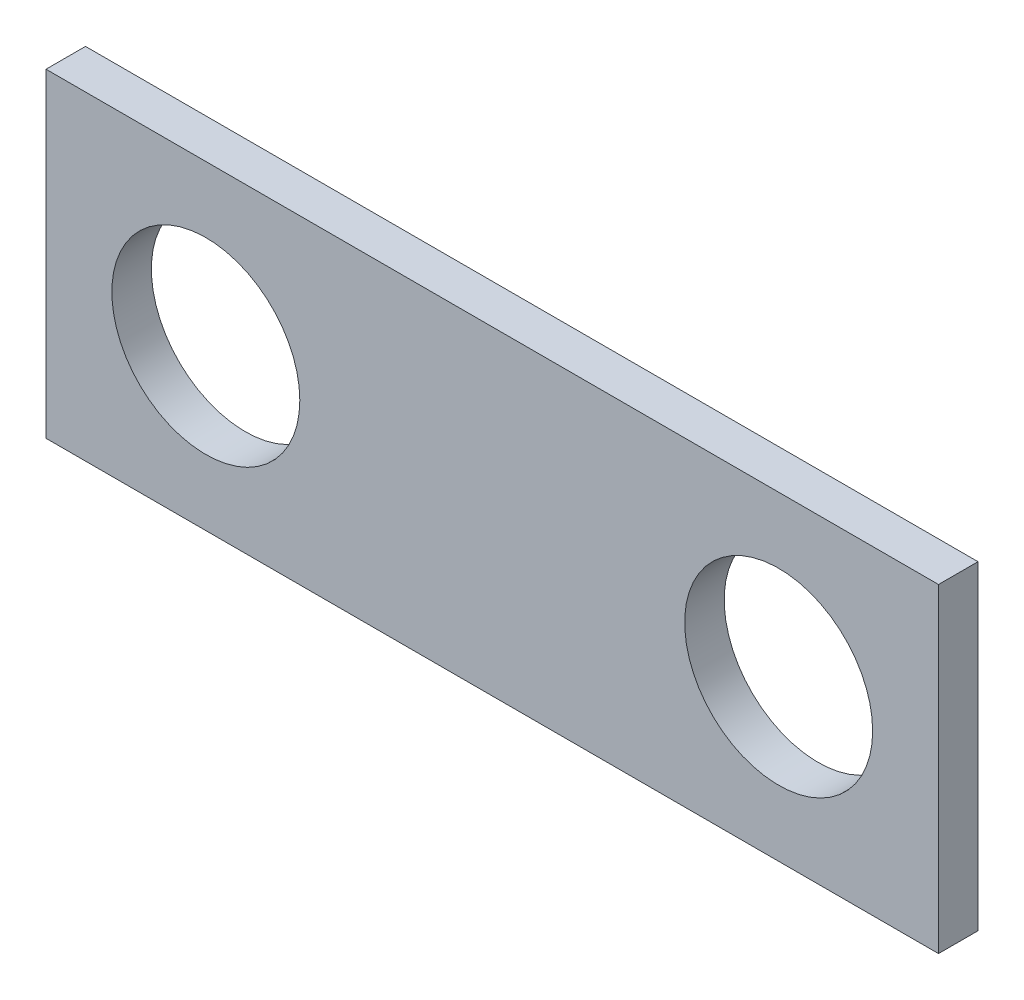
ISO-10303-21;
HEADER;
FILE_DESCRIPTION(('STEP AP214'),'2;1');
FILE_NAME('part.step','',(''),(''),'','','');
FILE_SCHEMA(('AUTOMOTIVE_DESIGN { 1 0 10303 214 1 1 1 1 }'));
ENDSEC;
DATA;
#1=APPLICATION_CONTEXT('core data for automotive mechanical design processes');
#2=APPLICATION_PROTOCOL_DEFINITION('international standard','automotive_design',2000,#1);
#3=PRODUCT_CONTEXT('',#1,'mechanical');
#4=PRODUCT('Part','Part','',(#3));
#5=PRODUCT_RELATED_PRODUCT_CATEGORY('part','',(#4));
#6=PRODUCT_DEFINITION_FORMATION('','',#4);
#7=PRODUCT_DEFINITION_CONTEXT('part definition',#1,'design');
#8=PRODUCT_DEFINITION('design','',#6,#7);
#9=PRODUCT_DEFINITION_SHAPE('','',#8);
#10=(LENGTH_UNIT() NAMED_UNIT(*) SI_UNIT(.MILLI.,.METRE.));
#11=(NAMED_UNIT(*) PLANE_ANGLE_UNIT() SI_UNIT($,.RADIAN.));
#12=(NAMED_UNIT(*) SI_UNIT($,.STERADIAN.) SOLID_ANGLE_UNIT());
#13=UNCERTAINTY_MEASURE_WITH_UNIT(LENGTH_MEASURE(1.E-05),#10,'distance_accuracy_value','');
#14=(GEOMETRIC_REPRESENTATION_CONTEXT(3) GLOBAL_UNCERTAINTY_ASSIGNED_CONTEXT((#13)) GLOBAL_UNIT_ASSIGNED_CONTEXT((#10,
#11,#12)) REPRESENTATION_CONTEXT('',''));
#15=CARTESIAN_POINT('',(0.,0.,0.));
#16=DIRECTION('',(0.,0.,1.));
#17=DIRECTION('',(1.,0.,0.));
#18=AXIS2_PLACEMENT_3D('',#15,#16,#17);
#19=CARTESIAN_POINT('',(0.,0.,6.));
#20=DIRECTION('',(0.,0.,-1.));
#21=DIRECTION('',(-1.,0.,0.));
#22=AXIS2_PLACEMENT_3D('',#19,#20,#21);
#23=PLANE('',#22);
#24=DIRECTION('',(0.,-1.,0.));
#25=VECTOR('',#24,1.);
#26=CARTESIAN_POINT('',(0.,0.,6.));
#27=LINE('',#26,#25);
#28=CARTESIAN_POINT('',(0.,48.5496,6.));
#29=VERTEX_POINT('',#28);
#30=CARTESIAN_POINT('',(0.,0.,6.));
#31=VERTEX_POINT('',#30);
#32=EDGE_CURVE('E91',#29,#31,#27,.T.);
#33=ORIENTED_EDGE('',*,*,#32,.T.);
#34=DIRECTION('',(1.,0.,0.));
#35=VECTOR('',#34,1.);
#36=CARTESIAN_POINT('',(0.,0.,6.));
#37=LINE('',#36,#35);
#38=CARTESIAN_POINT('',(135.5496,0.,6.));
#39=VERTEX_POINT('',#38);
#40=EDGE_CURVE('E86',#31,#39,#37,.T.);
#41=ORIENTED_EDGE('',*,*,#40,.T.);
#42=DIRECTION('',(0.,1.,0.));
#43=VECTOR('',#42,1.);
#44=CARTESIAN_POINT('',(135.5496,0.,6.));
#45=LINE('',#44,#43);
#46=CARTESIAN_POINT('',(135.5496,48.5496,6.));
#47=VERTEX_POINT('',#46);
#48=EDGE_CURVE('E89',#39,#47,#45,.T.);
#49=ORIENTED_EDGE('',*,*,#48,.T.);
#50=DIRECTION('',(-1.,0.,0.));
#51=VECTOR('',#50,1.);
#52=CARTESIAN_POINT('',(0.,48.5496,6.));
#53=LINE('',#52,#51);
#54=EDGE_CURVE('E56',#47,#29,#53,.T.);
#55=ORIENTED_EDGE('',*,*,#54,.T.);
#56=EDGE_LOOP('',(#33,#41,#49,#55));
#57=FACE_BOUND('',#56,.T.);
#58=CARTESIAN_POINT('',(24.2748,24.2748,6.));
#59=DIRECTION('',(0.,0.,1.));
#60=DIRECTION('',(1.,0.,0.));
#61=AXIS2_PLACEMENT_3D('',#58,#59,#60);
#62=CIRCLE('',#61,14.2748);
#63=CARTESIAN_POINT('',(38.5496,24.2748,6.));
#64=VERTEX_POINT('',#63);
#65=EDGE_CURVE('E106',#64,#64,#62,.T.);
#66=ORIENTED_EDGE('',*,*,#65,.F.);
#67=EDGE_LOOP('',(#66));
#68=FACE_BOUND('',#67,.T.);
#69=CARTESIAN_POINT('',(111.2748,24.2748,6.));
#70=DIRECTION('',(0.,0.,1.));
#71=DIRECTION('',(1.,0.,0.));
#72=AXIS2_PLACEMENT_3D('',#69,#70,#71);
#73=CIRCLE('',#72,14.2748);
#74=CARTESIAN_POINT('',(125.5496,24.2748,6.));
#75=VERTEX_POINT('',#74);
#76=EDGE_CURVE('E121',#75,#75,#73,.T.);
#77=ORIENTED_EDGE('',*,*,#76,.F.);
#78=EDGE_LOOP('',(#77));
#79=FACE_BOUND('',#78,.T.);
#80=ADVANCED_FACE('F39',(#57,#68,#79),#23,.F.);
#81=CARTESIAN_POINT('',(0.,0.,0.));
#82=DIRECTION('',(0.,0.,-1.));
#83=DIRECTION('',(-1.,0.,0.));
#84=AXIS2_PLACEMENT_3D('',#81,#82,#83);
#85=PLANE('',#84);
#86=CARTESIAN_POINT('',(24.2748,24.2748,0.));
#87=DIRECTION('',(0.,0.,1.));
#88=DIRECTION('',(1.,0.,0.));
#89=AXIS2_PLACEMENT_3D('',#86,#87,#88);
#90=CIRCLE('',#89,14.2748);
#91=CARTESIAN_POINT('',(38.5496,24.2748,0.));
#92=VERTEX_POINT('',#91);
#93=EDGE_CURVE('E118',#92,#92,#90,.T.);
#94=ORIENTED_EDGE('',*,*,#93,.T.);
#95=EDGE_LOOP('',(#94));
#96=FACE_BOUND('',#95,.T.);
#97=DIRECTION('',(0.,-1.,0.));
#98=VECTOR('',#97,1.);
#99=CARTESIAN_POINT('',(0.,0.,0.));
#100=LINE('',#99,#98);
#101=CARTESIAN_POINT('',(0.,48.5496,0.));
#102=VERTEX_POINT('',#101);
#103=CARTESIAN_POINT('',(0.,0.,0.));
#104=VERTEX_POINT('',#103);
#105=EDGE_CURVE('E103',#102,#104,#100,.T.);
#106=ORIENTED_EDGE('',*,*,#105,.F.);
#107=DIRECTION('',(-1.,0.,0.));
#108=VECTOR('',#107,1.);
#109=CARTESIAN_POINT('',(0.,48.5496,0.));
#110=LINE('',#109,#108);
#111=CARTESIAN_POINT('',(135.5496,48.5496,0.));
#112=VERTEX_POINT('',#111);
#113=EDGE_CURVE('E79',#112,#102,#110,.T.);
#114=ORIENTED_EDGE('',*,*,#113,.F.);
#115=DIRECTION('',(0.,1.,0.));
#116=VECTOR('',#115,1.);
#117=CARTESIAN_POINT('',(135.5496,0.,0.));
#118=LINE('',#117,#116);
#119=CARTESIAN_POINT('',(135.5496,0.,0.));
#120=VERTEX_POINT('',#119);
#121=EDGE_CURVE('E73',#120,#112,#118,.T.);
#122=ORIENTED_EDGE('',*,*,#121,.F.);
#123=DIRECTION('',(1.,0.,0.));
#124=VECTOR('',#123,1.);
#125=CARTESIAN_POINT('',(0.,0.,0.));
#126=LINE('',#125,#124);
#127=EDGE_CURVE('E95',#104,#120,#126,.T.);
#128=ORIENTED_EDGE('',*,*,#127,.F.);
#129=EDGE_LOOP('',(#106,#114,#122,#128));
#130=FACE_BOUND('',#129,.T.);
#131=CARTESIAN_POINT('',(111.2748,24.2748,0.));
#132=DIRECTION('',(0.,0.,1.));
#133=DIRECTION('',(1.,0.,0.));
#134=AXIS2_PLACEMENT_3D('',#131,#132,#133);
#135=CIRCLE('',#134,14.2748);
#136=CARTESIAN_POINT('',(125.5496,24.2748,0.));
#137=VERTEX_POINT('',#136);
#138=EDGE_CURVE('E124',#137,#137,#135,.T.);
#139=ORIENTED_EDGE('',*,*,#138,.T.);
#140=EDGE_LOOP('',(#139));
#141=FACE_BOUND('',#140,.T.);
#142=ADVANCED_FACE('F114',(#96,#130,#141),#85,.T.);
#143=CARTESIAN_POINT('',(0.,0.,6.));
#144=DIRECTION('',(1.,0.,0.));
#145=DIRECTION('',(0.,0.,-1.));
#146=AXIS2_PLACEMENT_3D('',#143,#144,#145);
#147=PLANE('',#146);
#148=ORIENTED_EDGE('',*,*,#105,.T.);
#149=DIRECTION('',(0.,0.,-1.));
#150=VECTOR('',#149,1.);
#151=CARTESIAN_POINT('',(0.,0.,6.));
#152=LINE('',#151,#150);
#153=EDGE_CURVE('E11',#31,#104,#152,.T.);
#154=ORIENTED_EDGE('',*,*,#153,.F.);
#155=ORIENTED_EDGE('',*,*,#32,.F.);
#156=DIRECTION('',(0.,0.,-1.));
#157=VECTOR('',#156,1.);
#158=CARTESIAN_POINT('',(0.,48.5496,6.));
#159=LINE('',#158,#157);
#160=EDGE_CURVE('E99',#29,#102,#159,.T.);
#161=ORIENTED_EDGE('',*,*,#160,.T.);
#162=EDGE_LOOP('',(#148,#154,#155,#161));
#163=FACE_BOUND('',#162,.T.);
#164=ADVANCED_FACE('F41',(#163),#147,.F.);
#165=CARTESIAN_POINT('',(0.,0.,6.));
#166=DIRECTION('',(0.,1.,0.));
#167=DIRECTION('',(0.,0.,1.));
#168=AXIS2_PLACEMENT_3D('',#165,#166,#167);
#169=PLANE('',#168);
#170=ORIENTED_EDGE('',*,*,#127,.T.);
#171=DIRECTION('',(0.,0.,-1.));
#172=VECTOR('',#171,1.);
#173=CARTESIAN_POINT('',(135.5496,0.,6.));
#174=LINE('',#173,#172);
#175=EDGE_CURVE('E48',#39,#120,#174,.T.);
#176=ORIENTED_EDGE('',*,*,#175,.F.);
#177=ORIENTED_EDGE('',*,*,#40,.F.);
#178=ORIENTED_EDGE('',*,*,#153,.T.);
#179=EDGE_LOOP('',(#170,#176,#177,#178));
#180=FACE_BOUND('',#179,.T.);
#181=ADVANCED_FACE('F94',(#180),#169,.F.);
#182=CARTESIAN_POINT('',(135.5496,0.,6.));
#183=DIRECTION('',(-1.,0.,0.));
#184=DIRECTION('',(0.,0.,1.));
#185=AXIS2_PLACEMENT_3D('',#182,#183,#184);
#186=PLANE('',#185);
#187=ORIENTED_EDGE('',*,*,#121,.T.);
#188=DIRECTION('',(0.,0.,-1.));
#189=VECTOR('',#188,1.);
#190=CARTESIAN_POINT('',(135.5496,48.5496,6.));
#191=LINE('',#190,#189);
#192=EDGE_CURVE('E96',#47,#112,#191,.T.);
#193=ORIENTED_EDGE('',*,*,#192,.F.);
#194=ORIENTED_EDGE('',*,*,#48,.F.);
#195=ORIENTED_EDGE('',*,*,#175,.T.);
#196=EDGE_LOOP('',(#187,#193,#194,#195));
#197=FACE_BOUND('',#196,.T.);
#198=ADVANCED_FACE('F97',(#197),#186,.F.);
#199=CARTESIAN_POINT('',(0.,48.5496,6.));
#200=DIRECTION('',(0.,-1.,0.));
#201=DIRECTION('',(1.,0.,0.));
#202=AXIS2_PLACEMENT_3D('',#199,#200,#201);
#203=PLANE('',#202);
#204=ORIENTED_EDGE('',*,*,#113,.T.);
#205=ORIENTED_EDGE('',*,*,#160,.F.);
#206=ORIENTED_EDGE('',*,*,#54,.F.);
#207=ORIENTED_EDGE('',*,*,#192,.T.);
#208=EDGE_LOOP('',(#204,#205,#206,#207));
#209=FACE_BOUND('',#208,.T.);
#210=ADVANCED_FACE('F111',(#209),#203,.F.);
#211=CARTESIAN_POINT('',(24.2748,24.2748,6.));
#212=DIRECTION('',(0.,0.,-1.));
#213=DIRECTION('',(-1.,0.,0.));
#214=AXIS2_PLACEMENT_3D('',#211,#212,#213);
#215=CYLINDRICAL_SURFACE('',#214,14.2748);
#216=ORIENTED_EDGE('',*,*,#65,.T.);
#217=EDGE_LOOP('',(#216));
#218=FACE_BOUND('',#217,.T.);
#219=ORIENTED_EDGE('',*,*,#93,.F.);
#220=EDGE_LOOP('',(#219));
#221=FACE_BOUND('',#220,.T.);
#222=ADVANCED_FACE('F141',(#218,#221),#215,.F.);
#223=CARTESIAN_POINT('',(111.2748,24.2748,6.));
#224=DIRECTION('',(0.,0.,-1.));
#225=DIRECTION('',(-1.,0.,0.));
#226=AXIS2_PLACEMENT_3D('',#223,#224,#225);
#227=CYLINDRICAL_SURFACE('',#226,14.2748);
#228=ORIENTED_EDGE('',*,*,#76,.T.);
#229=EDGE_LOOP('',(#228));
#230=FACE_BOUND('',#229,.T.);
#231=ORIENTED_EDGE('',*,*,#138,.F.);
#232=EDGE_LOOP('',(#231));
#233=FACE_BOUND('',#232,.T.);
#234=ADVANCED_FACE('F130',(#230,#233),#227,.F.);
#235=CLOSED_SHELL('',(#80,#142,#164,#181,#198,#210,#222,#234));
#236=MANIFOLD_SOLID_BREP('B2',#235);
#237=ADVANCED_BREP_SHAPE_REPRESENTATION('',(#18,#236),#14);
#238=SHAPE_DEFINITION_REPRESENTATION(#9,#237);
ENDSEC;
END-ISO-10303-21;
